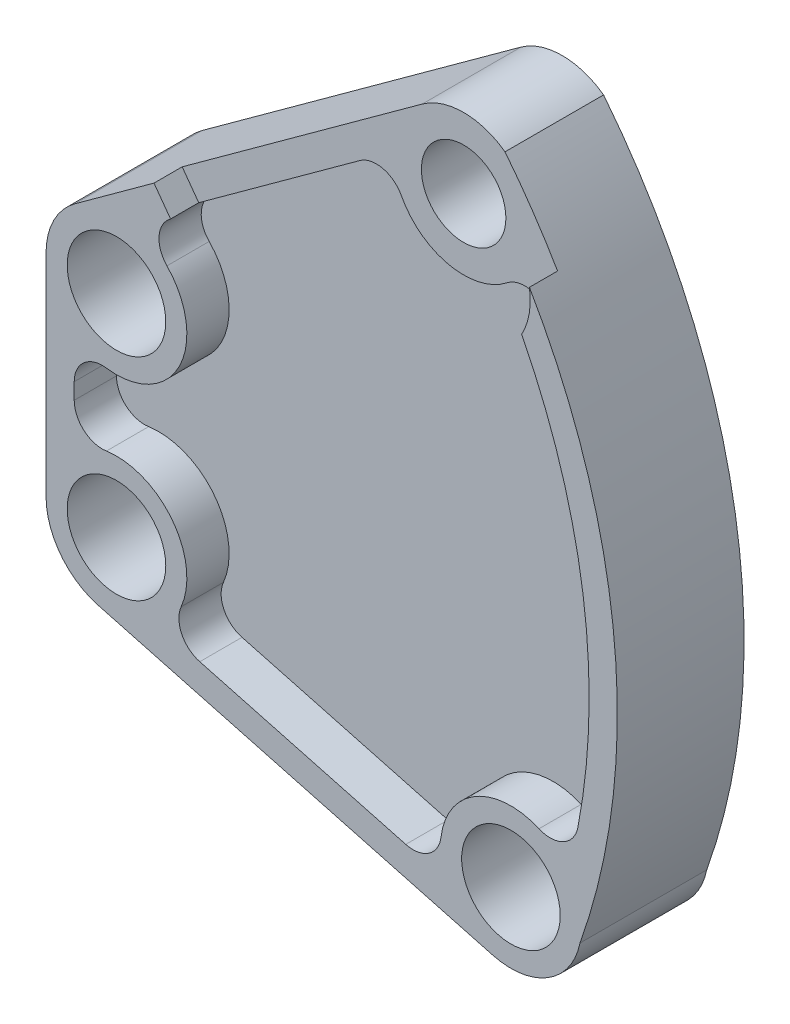
ISO-10303-21;
HEADER;
FILE_DESCRIPTION(('STEP AP214'),'2;1');
FILE_NAME('part.step','',(''),(''),'','','');
FILE_SCHEMA(('AUTOMOTIVE_DESIGN { 1 0 10303 214 1 1 1 1 }'));
ENDSEC;
DATA;
#1=APPLICATION_CONTEXT('core data for automotive mechanical design processes');
#2=APPLICATION_PROTOCOL_DEFINITION('international standard','automotive_design',2000,#1);
#3=PRODUCT_CONTEXT('',#1,'mechanical');
#4=PRODUCT('Part','Part','',(#3));
#5=PRODUCT_RELATED_PRODUCT_CATEGORY('part','',(#4));
#6=PRODUCT_DEFINITION_FORMATION('','',#4);
#7=PRODUCT_DEFINITION_CONTEXT('part definition',#1,'design');
#8=PRODUCT_DEFINITION('design','',#6,#7);
#9=PRODUCT_DEFINITION_SHAPE('','',#8);
#10=(LENGTH_UNIT() NAMED_UNIT(*) SI_UNIT(.MILLI.,.METRE.));
#11=(NAMED_UNIT(*) PLANE_ANGLE_UNIT() SI_UNIT($,.RADIAN.));
#12=(NAMED_UNIT(*) SI_UNIT($,.STERADIAN.) SOLID_ANGLE_UNIT());
#13=UNCERTAINTY_MEASURE_WITH_UNIT(LENGTH_MEASURE(1.E-05),#10,'distance_accuracy_value','');
#14=(GEOMETRIC_REPRESENTATION_CONTEXT(3) GLOBAL_UNCERTAINTY_ASSIGNED_CONTEXT((#13)) GLOBAL_UNIT_ASSIGNED_CONTEXT((#10,
#11,#12)) REPRESENTATION_CONTEXT('',''));
#15=CARTESIAN_POINT('',(0.,0.,0.));
#16=DIRECTION('',(0.,0.,1.));
#17=DIRECTION('',(1.,0.,0.));
#18=AXIS2_PLACEMENT_3D('',#15,#16,#17);
#19=CARTESIAN_POINT('',(-22.6524758424985,-16.4579870641893,12.));
#20=DIRECTION('',(0.,0.,1.));
#21=DIRECTION('',(1.,0.,0.));
#22=AXIS2_PLACEMENT_3D('',#19,#20,#21);
#23=CYLINDRICAL_SURFACE('',#22,5.);
#24=CARTESIAN_POINT('',(-22.6524758424985,-16.4579870641893,14.));
#25=DIRECTION('',(0.,0.,1.));
#26=DIRECTION('',(1.,0.,0.));
#27=AXIS2_PLACEMENT_3D('',#24,#25,#26);
#28=CIRCLE('',#27,5.);
#29=CARTESIAN_POINT('',(-23.3667615567843,-21.4067036572432,14.));
#30=VERTEX_POINT('',#29);
#31=CARTESIAN_POINT('',(-19.068726627153,-12.9713351513207,14.));
#32=VERTEX_POINT('',#31);
#33=EDGE_CURVE('E406',#30,#32,#28,.T.);
#34=ORIENTED_EDGE('',*,*,#33,.F.);
#35=DIRECTION('',(0.,0.,1.));
#36=VECTOR('',#35,1.);
#37=CARTESIAN_POINT('',(-23.3667615567843,-21.4067036572432,12.));
#38=LINE('',#37,#36);
#39=CARTESIAN_POINT('',(-23.3667615567843,-21.4067036572432,11.));
#40=VERTEX_POINT('',#39);
#41=EDGE_CURVE('E292',#30,#40,#38,.F.);
#42=ORIENTED_EDGE('',*,*,#41,.T.);
#43=CARTESIAN_POINT('',(-22.6524758424985,-16.4579870641893,11.));
#44=DIRECTION('',(0.,0.,-1.));
#45=DIRECTION('',(-1.,0.,0.));
#46=AXIS2_PLACEMENT_3D('',#43,#44,#45);
#47=CIRCLE('',#46,5.);
#48=CARTESIAN_POINT('',(-19.068726627153,-12.9713351513207,11.));
#49=VERTEX_POINT('',#48);
#50=EDGE_CURVE('E454',#49,#40,#47,.T.);
#51=ORIENTED_EDGE('',*,*,#50,.F.);
#52=DIRECTION('',(0.,0.,1.));
#53=VECTOR('',#52,1.);
#54=CARTESIAN_POINT('',(-19.068726627153,-12.9713351513207,12.));
#55=LINE('',#54,#53);
#56=EDGE_CURVE('E289',#49,#32,#55,.T.);
#57=ORIENTED_EDGE('',*,*,#56,.T.);
#58=EDGE_LOOP('',(#34,#42,#51,#57));
#59=FACE_BOUND('',#58,.T.);
#60=ADVANCED_FACE('F39',(#59),#23,.T.);
#61=CARTESIAN_POINT('',(-25.6524758424985,-27.4579870641893,12.));
#62=DIRECTION('',(1.,0.,0.));
#63=DIRECTION('',(0.,0.,-1.));
#64=AXIS2_PLACEMENT_3D('',#61,#62,#63);
#65=PLANE('',#64);
#66=DIRECTION('',(0.,-1.,0.));
#67=VECTOR('',#66,1.);
#68=CARTESIAN_POINT('',(-25.6524758424985,-20.4579870641892,11.));
#69=LINE('',#68,#67);
#70=CARTESIAN_POINT('',(-25.6524758424985,-23.3861902944648,11.));
#71=VERTEX_POINT('',#70);
#72=CARTESIAN_POINT('',(-25.6524758424985,-24.5297838339137,11.));
#73=VERTEX_POINT('',#72);
#74=EDGE_CURVE('E451',#71,#73,#69,.T.);
#75=ORIENTED_EDGE('',*,*,#74,.F.);
#76=DIRECTION('',(0.,0.,-1.));
#77=VECTOR('',#76,1.);
#78=CARTESIAN_POINT('',(-25.6524758424985,-23.3861902944648,14.));
#79=LINE('',#78,#77);
#80=CARTESIAN_POINT('',(-25.6524758424985,-23.3861902944648,14.));
#81=VERTEX_POINT('',#80);
#82=EDGE_CURVE('E286',#71,#81,#79,.F.);
#83=ORIENTED_EDGE('',*,*,#82,.T.);
#84=DIRECTION('',(0.,1.,0.));
#85=VECTOR('',#84,1.);
#86=CARTESIAN_POINT('',(-25.6524758424985,-27.4579870641893,14.));
#87=LINE('',#86,#85);
#88=CARTESIAN_POINT('',(-25.6524758424985,-24.5297838339137,14.));
#89=VERTEX_POINT('',#88);
#90=EDGE_CURVE('E382',#89,#81,#87,.T.);
#91=ORIENTED_EDGE('',*,*,#90,.F.);
#92=DIRECTION('',(0.,0.,-1.));
#93=VECTOR('',#92,1.);
#94=CARTESIAN_POINT('',(-25.6524758424985,-24.5297838339137,11.));
#95=LINE('',#94,#93);
#96=EDGE_CURVE('E284',#89,#73,#95,.T.);
#97=ORIENTED_EDGE('',*,*,#96,.T.);
#98=EDGE_LOOP('',(#75,#83,#91,#97));
#99=FACE_BOUND('',#98,.T.);
#100=ADVANCED_FACE('F513',(#99),#65,.T.);
#101=CARTESIAN_POINT('',(-22.6524758424985,-31.4579870641893,12.));
#102=DIRECTION('',(0.,0.,1.));
#103=DIRECTION('',(1.,0.,0.));
#104=AXIS2_PLACEMENT_3D('',#101,#102,#103);
#105=CYLINDRICAL_SURFACE('',#104,5.);
#106=CARTESIAN_POINT('',(-22.6524758424985,-31.4579870641893,14.));
#107=DIRECTION('',(0.,0.,1.));
#108=DIRECTION('',(1.,0.,0.));
#109=AXIS2_PLACEMENT_3D('',#106,#107,#108);
#110=CIRCLE('',#109,5.);
#111=CARTESIAN_POINT('',(-18.0572534247843,-33.4287561860644,14.));
#112=VERTEX_POINT('',#111);
#113=CARTESIAN_POINT('',(-23.3667615567843,-26.5092704711353,14.));
#114=VERTEX_POINT('',#113);
#115=EDGE_CURVE('E379',#112,#114,#110,.T.);
#116=ORIENTED_EDGE('',*,*,#115,.F.);
#117=DIRECTION('',(0.,0.,1.));
#118=VECTOR('',#117,1.);
#119=CARTESIAN_POINT('',(-18.0572534247843,-33.4287561860644,12.));
#120=LINE('',#119,#118);
#121=CARTESIAN_POINT('',(-18.0572534247843,-33.4287561860644,11.));
#122=VERTEX_POINT('',#121);
#123=EDGE_CURVE('E311',#112,#122,#120,.F.);
#124=ORIENTED_EDGE('',*,*,#123,.T.);
#125=CARTESIAN_POINT('',(-22.6524758424985,-31.4579870641893,11.));
#126=DIRECTION('',(0.,0.,-1.));
#127=DIRECTION('',(-1.,0.,0.));
#128=AXIS2_PLACEMENT_3D('',#125,#126,#127);
#129=CIRCLE('',#128,5.);
#130=CARTESIAN_POINT('',(-23.3667615567843,-26.5092704711353,11.));
#131=VERTEX_POINT('',#130);
#132=EDGE_CURVE('E448',#131,#122,#129,.T.);
#133=ORIENTED_EDGE('',*,*,#132,.F.);
#134=DIRECTION('',(0.,0.,1.));
#135=VECTOR('',#134,1.);
#136=CARTESIAN_POINT('',(-23.3667615567843,-26.5092704711353,12.));
#137=LINE('',#136,#135);
#138=EDGE_CURVE('E308',#131,#114,#137,.T.);
#139=ORIENTED_EDGE('',*,*,#138,.T.);
#140=EDGE_LOOP('',(#116,#124,#133,#139));
#141=FACE_BOUND('',#140,.T.);
#142=ADVANCED_FACE('F520',(#141),#105,.T.);
#143=CARTESIAN_POINT('',(0.719212679420618,-40.8262406706195,12.));
#144=DIRECTION('',(0.25881904510252,0.965925826289069,0.));
#145=DIRECTION('',(-0.965925826289069,0.25881904510252,0.));
#146=AXIS2_PLACEMENT_3D('',#143,#144,#145);
#147=PLANE('',#146);
#148=DIRECTION('',(0.965925826289068,-0.25881904510252,0.));
#149=VECTOR('',#148,1.);
#150=CARTESIAN_POINT('',(-19.5652296726498,-35.3910407234665,11.));
#151=LINE('',#150,#149);
#152=CARTESIAN_POINT('',(-16.7368025479036,-36.1489154873926,11.));
#153=VERTEX_POINT('',#152);
#154=CARTESIAN_POINT('',(-2.10921444532555,-40.0683659066934,11.));
#155=VERTEX_POINT('',#154);
#156=EDGE_CURVE('E445',#153,#155,#151,.T.);
#157=ORIENTED_EDGE('',*,*,#156,.F.);
#158=DIRECTION('',(0.,0.,-1.));
#159=VECTOR('',#158,1.);
#160=CARTESIAN_POINT('',(-16.7368025479036,-36.1489154873926,14.));
#161=LINE('',#160,#159);
#162=CARTESIAN_POINT('',(-16.7368025479036,-36.1489154873926,14.));
#163=VERTEX_POINT('',#162);
#164=EDGE_CURVE('E305',#153,#163,#161,.F.);
#165=ORIENTED_EDGE('',*,*,#164,.T.);
#166=DIRECTION('',(-0.965925826289069,0.25881904510252,0.));
#167=VECTOR('',#166,1.);
#168=CARTESIAN_POINT('',(0.719212679420618,-40.8262406706195,14.));
#169=LINE('',#168,#167);
#170=CARTESIAN_POINT('',(-2.10921444532555,-40.0683659066934,14.));
#171=VERTEX_POINT('',#170);
#172=EDGE_CURVE('E376',#171,#163,#169,.T.);
#173=ORIENTED_EDGE('',*,*,#172,.F.);
#174=DIRECTION('',(0.,0.,-1.));
#175=VECTOR('',#174,1.);
#176=CARTESIAN_POINT('',(-2.10921444532555,-40.0683659066934,11.));
#177=LINE('',#176,#175);
#178=EDGE_CURVE('E303',#171,#155,#177,.T.);
#179=ORIENTED_EDGE('',*,*,#178,.T.);
#180=EDGE_LOOP('',(#157,#165,#173,#179));
#181=FACE_BOUND('',#180,.T.);
#182=ADVANCED_FACE('F591',(#181),#147,.T.);
#183=CARTESIAN_POINT('',(5.35937311988448,-38.9637393721623,12.));
#184=DIRECTION('',(0.,0.,1.));
#185=DIRECTION('',(1.,0.,0.));
#186=AXIS2_PLACEMENT_3D('',#183,#184,#185);
#187=CYLINDRICAL_SURFACE('',#186,5.);
#188=CARTESIAN_POINT('',(5.35937311988448,-38.9637393721623,14.));
#189=DIRECTION('',(0.,0.,1.));
#190=DIRECTION('',(1.,0.,0.));
#191=AXIS2_PLACEMENT_3D('',#188,#189,#190);
#192=CIRCLE('',#191,5.);
#193=CARTESIAN_POINT('',(7.35080992285409,-34.3774359086115,14.));
#194=VERTEX_POINT('',#193);
#195=CARTESIAN_POINT('',(0.394409209166631,-38.372864287843,14.));
#196=VERTEX_POINT('',#195);
#197=EDGE_CURVE('E373',#194,#196,#192,.T.);
#198=ORIENTED_EDGE('',*,*,#197,.F.);
#199=DIRECTION('',(0.,0.,1.));
#200=VECTOR('',#199,1.);
#201=CARTESIAN_POINT('',(7.35080992285409,-34.3774359086115,12.));
#202=LINE('',#201,#200);
#203=CARTESIAN_POINT('',(7.35080992285408,-34.3774359086116,11.));
#204=VERTEX_POINT('',#203);
#205=EDGE_CURVE('E267',#194,#204,#202,.F.);
#206=ORIENTED_EDGE('',*,*,#205,.T.);
#207=CARTESIAN_POINT('',(5.35937311988446,-38.9637393721623,11.));
#208=DIRECTION('',(0.,0.,-1.));
#209=DIRECTION('',(-1.,0.,0.));
#210=AXIS2_PLACEMENT_3D('',#207,#208,#209);
#211=CIRCLE('',#210,4.99999999999999);
#212=CARTESIAN_POINT('',(0.394409209166627,-38.372864287843,11.));
#213=VERTEX_POINT('',#212);
#214=EDGE_CURVE('E442',#213,#204,#211,.T.);
#215=ORIENTED_EDGE('',*,*,#214,.F.);
#216=DIRECTION('',(0.,0.,1.));
#217=VECTOR('',#216,1.);
#218=CARTESIAN_POINT('',(0.39440920916663,-38.372864287843,12.));
#219=LINE('',#218,#217);
#220=EDGE_CURVE('E260',#213,#196,#219,.T.);
#221=ORIENTED_EDGE('',*,*,#220,.T.);
#222=EDGE_LOOP('',(#198,#206,#215,#221));
#223=FACE_BOUND('',#222,.T.);
#224=ADVANCED_FACE('F581',(#223),#187,.T.);
#225=CARTESIAN_POINT('',(-33.0866645912219,-24.5583554455818,12.));
#226=DIRECTION('',(0.,0.,1.));
#227=DIRECTION('',(1.,0.,0.));
#228=AXIS2_PLACEMENT_3D('',#225,#226,#227);
#229=CYLINDRICAL_SURFACE('',#228,44.);
#230=CARTESIAN_POINT('',(-33.086664591222,-24.5583554455818,11.));
#231=DIRECTION('',(0.,0.,1.));
#232=DIRECTION('',(1.,0.,0.));
#233=AXIS2_PLACEMENT_3D('',#230,#231,#232);
#234=CIRCLE('',#233,44.);
#235=CARTESIAN_POINT('',(10.1109107981021,-32.923131622125,11.));
#236=VERTEX_POINT('',#235);
#237=CARTESIAN_POINT('',(6.11949722855622,-4.58645329878155,11.));
#238=VERTEX_POINT('',#237);
#239=EDGE_CURVE('E426',#236,#238,#234,.T.);
#240=ORIENTED_EDGE('',*,*,#239,.F.);
#241=DIRECTION('',(0.,0.,1.));
#242=VECTOR('',#241,1.);
#243=CARTESIAN_POINT('',(10.1109107981021,-32.923131622125,12.));
#244=LINE('',#243,#242);
#245=CARTESIAN_POINT('',(10.1109107981021,-32.923131622125,14.));
#246=VERTEX_POINT('',#245);
#247=EDGE_CURVE('E258',#236,#246,#244,.T.);
#248=ORIENTED_EDGE('',*,*,#247,.T.);
#249=CARTESIAN_POINT('',(-33.0866645912219,-24.5583554455818,14.));
#250=DIRECTION('',(0.,0.,-1.));
#251=DIRECTION('',(-1.,0.,0.));
#252=AXIS2_PLACEMENT_3D('',#249,#250,#251);
#253=CIRCLE('',#252,44.);
#254=CARTESIAN_POINT('',(6.11949722855622,-4.58645329878154,14.));
#255=VERTEX_POINT('',#254);
#256=EDGE_CURVE('E244',#255,#246,#253,.T.);
#257=ORIENTED_EDGE('',*,*,#256,.F.);
#258=DIRECTION('',(0.,0.,1.));
#259=VECTOR('',#258,1.);
#260=CARTESIAN_POINT('',(6.11949722855622,-4.58645329878154,12.));
#261=LINE('',#260,#259);
#262=CARTESIAN_POINT('',(6.11949722855622,-4.58645329878156,12.));
#263=VERTEX_POINT('',#262);
#264=EDGE_CURVE('E237',#263,#255,#261,.T.);
#265=ORIENTED_EDGE('',*,*,#264,.F.);
#266=DIRECTION('',(0.,0.,1.));
#267=VECTOR('',#266,1.);
#268=CARTESIAN_POINT('',(6.11949722855622,-4.58645329878154,12.));
#269=LINE('',#268,#267);
#270=EDGE_CURVE('E240',#263,#238,#269,.F.);
#271=ORIENTED_EDGE('',*,*,#270,.T.);
#272=EDGE_LOOP('',(#240,#248,#257,#265,#271));
#273=FACE_BOUND('',#272,.T.);
#274=ADVANCED_FACE('F239',(#273),#229,.F.);
#275=CARTESIAN_POINT('',(1.73025928211613,-2.1917528478837,12.));
#276=DIRECTION('',(0.,0.,1.));
#277=DIRECTION('',(1.,0.,0.));
#278=AXIS2_PLACEMENT_3D('',#275,#276,#277);
#279=CYLINDRICAL_SURFACE('',#278,5.00000000000001);
#280=CARTESIAN_POINT('',(1.73025928211613,-2.1917528478837,14.));
#281=DIRECTION('',(0.,0.,-1.));
#282=DIRECTION('',(-1.,0.,0.));
#283=AXIS2_PLACEMENT_3D('',#280,#281,#282);
#284=CIRCLE('',#283,5.00000000000001);
#285=CARTESIAN_POINT('',(6.67035341824604,-1.42008586908067,14.));
#286=VERTEX_POINT('',#285);
#287=EDGE_CURVE('E370',#286,#255,#284,.T.);
#288=ORIENTED_EDGE('',*,*,#287,.F.);
#289=DIRECTION('',(0.,0.,1.));
#290=VECTOR('',#289,1.);
#291=CARTESIAN_POINT('',(6.67035341824604,-1.42008586908067,12.));
#292=LINE('',#291,#290);
#293=CARTESIAN_POINT('',(6.67035341824611,-1.42008586908083,12.));
#294=VERTEX_POINT('',#293);
#295=EDGE_CURVE('E248',#294,#286,#292,.T.);
#296=ORIENTED_EDGE('',*,*,#295,.F.);
#297=CARTESIAN_POINT('',(1.73025928211613,-2.1917528478837,12.));
#298=DIRECTION('',(0.,0.,-1.));
#299=DIRECTION('',(-1.,0.,0.));
#300=AXIS2_PLACEMENT_3D('',#297,#298,#299);
#301=CIRCLE('',#300,5.00000000000001);
#302=EDGE_CURVE('E224',#294,#263,#301,.T.);
#303=ORIENTED_EDGE('',*,*,#302,.T.);
#304=ORIENTED_EDGE('',*,*,#264,.T.);
#305=EDGE_LOOP('',(#288,#296,#303,#304));
#306=FACE_BOUND('',#305,.T.);
#307=ADVANCED_FACE('F251',(#306),#279,.F.);
#308=CARTESIAN_POINT('',(-33.0866645912219,-24.5583554455818,12.));
#309=DIRECTION('',(0.,0.,1.));
#310=DIRECTION('',(1.,0.,0.));
#311=AXIS2_PLACEMENT_3D('',#308,#309,#310);
#312=CYLINDRICAL_SURFACE('',#311,46.);
#313=CARTESIAN_POINT('',(-33.0866645912219,-24.5583554455818,14.));
#314=DIRECTION('',(0.,0.,1.));
#315=DIRECTION('',(1.,0.,0.));
#316=AXIS2_PLACEMENT_3D('',#313,#314,#315);
#317=CIRCLE('',#316,46.);
#318=CARTESIAN_POINT('',(10.2601455915492,-39.9549150281253,14.));
#319=VERTEX_POINT('',#318);
#320=EDGE_CURVE('E362',#319,#286,#317,.T.);
#321=ORIENTED_EDGE('',*,*,#320,.F.);
#322=DIRECTION('',(0.,0.,1.));
#323=VECTOR('',#322,1.);
#324=CARTESIAN_POINT('',(10.2601455915492,-39.9549150281253,12.));
#325=LINE('',#324,#323);
#326=CARTESIAN_POINT('',(10.2601455915492,-39.9549150281252,5.));
#327=VERTEX_POINT('',#326);
#328=EDGE_CURVE('E386',#327,#319,#325,.T.);
#329=ORIENTED_EDGE('',*,*,#328,.F.);
#330=CARTESIAN_POINT('',(-33.0866645912219,-24.5583554455818,5.));
#331=DIRECTION('',(0.,0.,-1.));
#332=DIRECTION('',(1.,0.,0.));
#333=AXIS2_PLACEMENT_3D('',#330,#331,#332);
#334=CIRCLE('',#333,46.);
#335=CARTESIAN_POINT('',(2.93892626146236,4.04508497187474,5.));
#336=VERTEX_POINT('',#335);
#337=EDGE_CURVE('E431',#336,#327,#334,.T.);
#338=ORIENTED_EDGE('',*,*,#337,.F.);
#339=DIRECTION('',(0.,0.,1.));
#340=VECTOR('',#339,1.);
#341=CARTESIAN_POINT('',(2.93892626146236,4.04508497187474,5.));
#342=LINE('',#341,#340);
#343=CARTESIAN_POINT('',(2.93892626146236,4.04508497187474,12.));
#344=VERTEX_POINT('',#343);
#345=EDGE_CURVE('E409',#336,#344,#342,.T.);
#346=ORIENTED_EDGE('',*,*,#345,.T.);
#347=CARTESIAN_POINT('',(-33.0866645912219,-24.5583554455818,12.));
#348=DIRECTION('',(0.,0.,-1.));
#349=DIRECTION('',(1.,0.,0.));
#350=AXIS2_PLACEMENT_3D('',#347,#348,#349);
#351=CIRCLE('',#350,46.);
#352=EDGE_CURVE('E421',#344,#294,#351,.T.);
#353=ORIENTED_EDGE('',*,*,#352,.T.);
#354=ORIENTED_EDGE('',*,*,#295,.T.);
#355=EDGE_LOOP('',(#321,#329,#338,#346,#353,#354));
#356=FACE_BOUND('',#355,.T.);
#357=ADVANCED_FACE('F574',(#356),#312,.T.);
#358=CARTESIAN_POINT('',(5.35937311988448,-38.9637393721623,12.));
#359=DIRECTION('',(0.,0.,1.));
#360=DIRECTION('',(1.,0.,0.));
#361=AXIS2_PLACEMENT_3D('',#358,#359,#360);
#362=CYLINDRICAL_SURFACE('',#361,5.);
#363=CARTESIAN_POINT('',(5.35937311988448,-38.9637393721623,14.));
#364=DIRECTION('',(0.,0.,1.));
#365=DIRECTION('',(1.,0.,0.));
#366=AXIS2_PLACEMENT_3D('',#363,#364,#365);
#367=CIRCLE('',#366,5.);
#368=CARTESIAN_POINT('',(4.06527789437187,-43.7933685036077,14.));
#369=VERTEX_POINT('',#368);
#370=EDGE_CURVE('E360',#369,#319,#367,.T.);
#371=ORIENTED_EDGE('',*,*,#370,.F.);
#372=DIRECTION('',(0.,0.,1.));
#373=VECTOR('',#372,1.);
#374=CARTESIAN_POINT('',(4.06527789437187,-43.7933685036077,12.));
#375=LINE('',#374,#373);
#376=CARTESIAN_POINT('',(4.06527789437188,-43.7933685036077,5.));
#377=VERTEX_POINT('',#376);
#378=EDGE_CURVE('E358',#377,#369,#375,.T.);
#379=ORIENTED_EDGE('',*,*,#378,.F.);
#380=CARTESIAN_POINT('',(5.35937311988448,-38.9637393721623,5.));
#381=DIRECTION('',(0.,0.,-1.));
#382=DIRECTION('',(1.,0.,0.));
#383=AXIS2_PLACEMENT_3D('',#380,#381,#382);
#384=CIRCLE('',#383,5.00000000000001);
#385=EDGE_CURVE('E429',#327,#377,#384,.T.);
#386=ORIENTED_EDGE('',*,*,#385,.F.);
#387=ORIENTED_EDGE('',*,*,#328,.T.);
#388=EDGE_LOOP('',(#371,#379,#386,#387));
#389=FACE_BOUND('',#388,.T.);
#390=ADVANCED_FACE('F576',(#389),#362,.T.);
#391=CARTESIAN_POINT('',(-27.6524758424985,-35.2946220040841,12.));
#392=DIRECTION('',(-0.258819045102521,-0.965925826289068,0.));
#393=DIRECTION('',(0.965925826289068,-0.258819045102521,0.));
#394=AXIS2_PLACEMENT_3D('',#391,#392,#393);
#395=PLANE('',#394);
#396=DIRECTION('',(0.965925826289068,-0.258819045102521,0.));
#397=VECTOR('',#396,1.);
#398=CARTESIAN_POINT('',(-27.6524758424985,-35.2946220040841,14.));
#399=LINE('',#398,#397);
#400=CARTESIAN_POINT('',(-23.9465710680111,-36.2876161956346,14.));
#401=VERTEX_POINT('',#400);
#402=EDGE_CURVE('E354',#401,#369,#399,.T.);
#403=ORIENTED_EDGE('',*,*,#402,.F.);
#404=DIRECTION('',(0.,0.,1.));
#405=VECTOR('',#404,1.);
#406=CARTESIAN_POINT('',(-23.9465710680111,-36.2876161956346,12.));
#407=LINE('',#406,#405);
#408=CARTESIAN_POINT('',(-23.9465710680111,-36.2876161956346,5.));
#409=VERTEX_POINT('',#408);
#410=EDGE_CURVE('E62',#401,#409,#407,.F.);
#411=ORIENTED_EDGE('',*,*,#410,.T.);
#412=DIRECTION('',(-0.965925826289069,0.25881904510252,0.));
#413=VECTOR('',#412,1.);
#414=CARTESIAN_POINT('',(-27.6524758424986,-35.2946220040841,5.));
#415=LINE('',#414,#413);
#416=EDGE_CURVE('E340',#377,#409,#415,.T.);
#417=ORIENTED_EDGE('',*,*,#416,.F.);
#418=ORIENTED_EDGE('',*,*,#378,.T.);
#419=EDGE_LOOP('',(#403,#411,#417,#418));
#420=FACE_BOUND('',#419,.T.);
#421=ADVANCED_FACE('F357',(#420),#395,.T.);
#422=CARTESIAN_POINT('',(-27.6524758424985,-13.9103598167171,12.));
#423=DIRECTION('',(-1.,0.,0.));
#424=DIRECTION('',(0.,-1.,0.));
#425=AXIS2_PLACEMENT_3D('',#422,#423,#424);
#426=PLANE('',#425);
#427=DIRECTION('',(0.,1.,0.));
#428=VECTOR('',#427,1.);
#429=CARTESIAN_POINT('',(-27.6524758424985,-13.9103598167171,5.));
#430=LINE('',#429,#428);
#431=CARTESIAN_POINT('',(-27.6524758424986,-31.4579870641893,5.));
#432=VERTEX_POINT('',#431);
#433=CARTESIAN_POINT('',(-27.6524758424985,-16.4579870641893,5.));
#434=VERTEX_POINT('',#433);
#435=EDGE_CURVE('E338',#432,#434,#430,.T.);
#436=ORIENTED_EDGE('',*,*,#435,.F.);
#437=DIRECTION('',(0.,0.,1.));
#438=VECTOR('',#437,1.);
#439=CARTESIAN_POINT('',(-27.6524758424985,-31.4579870641893,12.));
#440=LINE('',#439,#438);
#441=CARTESIAN_POINT('',(-27.6524758424985,-31.4579870641892,14.));
#442=VERTEX_POINT('',#441);
#443=EDGE_CURVE('E327',#432,#442,#440,.T.);
#444=ORIENTED_EDGE('',*,*,#443,.T.);
#445=DIRECTION('',(0.,-1.,0.));
#446=VECTOR('',#445,1.);
#447=CARTESIAN_POINT('',(-27.6524758424985,-13.9103598167171,14.));
#448=LINE('',#447,#446);
#449=CARTESIAN_POINT('',(-27.6524758424985,-16.4579870641893,14.));
#450=VERTEX_POINT('',#449);
#451=EDGE_CURVE('E356',#450,#442,#448,.T.);
#452=ORIENTED_EDGE('',*,*,#451,.F.);
#453=DIRECTION('',(0.,0.,1.));
#454=VECTOR('',#453,1.);
#455=CARTESIAN_POINT('',(-27.6524758424985,-16.4579870641893,12.));
#456=LINE('',#455,#454);
#457=EDGE_CURVE('E325',#450,#434,#456,.F.);
#458=ORIENTED_EDGE('',*,*,#457,.T.);
#459=EDGE_LOOP('',(#436,#444,#452,#458));
#460=FACE_BOUND('',#459,.T.);
#461=ADVANCED_FACE('F344',(#460),#426,.T.);
#462=CARTESIAN_POINT('',(-19.9863679501846,-8.34060640867353,12.));
#463=DIRECTION('',(-0.58778525229247,0.809016994374949,0.));
#464=DIRECTION('',(-0.809016994374949,-0.58778525229247,0.));
#465=AXIS2_PLACEMENT_3D('',#462,#463,#464);
#466=PLANE('',#465);
#467=DIRECTION('',(0.809016994374947,0.587785252292474,0.));
#468=VECTOR('',#467,1.);
#469=CARTESIAN_POINT('',(-2.93892626146235,4.04508497187475,5.));
#470=LINE('',#469,#468);
#471=CARTESIAN_POINT('',(-25.5914021039609,-12.4129020923145,5.));
#472=VERTEX_POINT('',#471);
#473=CARTESIAN_POINT('',(-2.93892626146235,4.04508497187475,5.));
#474=VERTEX_POINT('',#473);
#475=EDGE_CURVE('E348',#472,#474,#470,.T.);
#476=ORIENTED_EDGE('',*,*,#475,.F.);
#477=DIRECTION('',(0.,0.,1.));
#478=VECTOR('',#477,1.);
#479=CARTESIAN_POINT('',(-25.5914021039609,-12.4129020923145,12.));
#480=LINE('',#479,#478);
#481=CARTESIAN_POINT('',(-25.5914021039609,-12.4129020923145,14.));
#482=VERTEX_POINT('',#481);
#483=EDGE_CURVE('E11',#472,#482,#480,.T.);
#484=ORIENTED_EDGE('',*,*,#483,.T.);
#485=DIRECTION('',(-0.809016994374949,-0.58778525229247,0.));
#486=VECTOR('',#485,1.);
#487=CARTESIAN_POINT('',(-19.9863679501846,-8.34060640867353,14.));
#488=LINE('',#487,#486);
#489=CARTESIAN_POINT('',(-19.9863679501846,-8.34060640867353,14.));
#490=VERTEX_POINT('',#489);
#491=EDGE_CURVE('E364',#490,#482,#488,.T.);
#492=ORIENTED_EDGE('',*,*,#491,.F.);
#493=DIRECTION('',(0.,0.,1.));
#494=VECTOR('',#493,1.);
#495=CARTESIAN_POINT('',(-19.9863679501846,-8.34060640867353,12.));
#496=LINE('',#495,#494);
#497=CARTESIAN_POINT('',(-19.9863679501846,-8.3406064086735,12.));
#498=VERTEX_POINT('',#497);
#499=EDGE_CURVE('E388',#498,#490,#496,.T.);
#500=ORIENTED_EDGE('',*,*,#499,.F.);
#501=DIRECTION('',(0.809016994374947,0.587785252292474,0.));
#502=VECTOR('',#501,1.);
#503=CARTESIAN_POINT('',(-2.93892626146235,4.04508497187475,12.));
#504=LINE('',#503,#502);
#505=CARTESIAN_POINT('',(-2.93892626146235,4.04508497187475,12.));
#506=VERTEX_POINT('',#505);
#507=EDGE_CURVE('E418',#498,#506,#504,.T.);
#508=ORIENTED_EDGE('',*,*,#507,.T.);
#509=DIRECTION('',(0.,0.,1.));
#510=VECTOR('',#509,1.);
#511=CARTESIAN_POINT('',(-2.93892626146235,4.04508497187475,5.));
#512=LINE('',#511,#510);
#513=EDGE_CURVE('E415',#474,#506,#512,.T.);
#514=ORIENTED_EDGE('',*,*,#513,.F.);
#515=EDGE_LOOP('',(#476,#484,#492,#500,#508,#514));
#516=FACE_BOUND('',#515,.T.);
#517=ADVANCED_FACE('F564',(#516),#466,.T.);
#518=CARTESIAN_POINT('',(-18.8107974455997,-9.9586403974234,12.));
#519=DIRECTION('',(0.809016994374949,0.587785252292472,0.));
#520=DIRECTION('',(-0.587785252292472,0.809016994374949,0.));
#521=AXIS2_PLACEMENT_3D('',#518,#519,#520);
#522=PLANE('',#521);
#523=DIRECTION('',(-0.587785252292472,0.809016994374949,0.));
#524=VECTOR('',#523,1.);
#525=CARTESIAN_POINT('',(-18.8107974455997,-9.9586403974234,14.));
#526=LINE('',#525,#524);
#527=CARTESIAN_POINT('',(-18.8107974455997,-9.9586403974234,14.));
#528=VERTEX_POINT('',#527);
#529=EDGE_CURVE('E404',#528,#490,#526,.T.);
#530=ORIENTED_EDGE('',*,*,#529,.F.);
#531=DIRECTION('',(0.,0.,1.));
#532=VECTOR('',#531,1.);
#533=CARTESIAN_POINT('',(-18.8107974455997,-9.9586403974234,12.));
#534=LINE('',#533,#532);
#535=CARTESIAN_POINT('',(-18.8107974455997,-9.9586403974234,12.));
#536=VERTEX_POINT('',#535);
#537=EDGE_CURVE('E252',#536,#528,#534,.T.);
#538=ORIENTED_EDGE('',*,*,#537,.F.);
#539=DIRECTION('',(-0.587785252292472,0.809016994374949,0.));
#540=VECTOR('',#539,1.);
#541=CARTESIAN_POINT('',(-18.8107974455997,-9.9586403974234,12.));
#542=LINE('',#541,#540);
#543=EDGE_CURVE('E253',#536,#498,#542,.T.);
#544=ORIENTED_EDGE('',*,*,#543,.T.);
#545=ORIENTED_EDGE('',*,*,#499,.T.);
#546=EDGE_LOOP('',(#530,#538,#544,#545));
#547=FACE_BOUND('',#546,.T.);
#548=ADVANCED_FACE('F401',(#547),#522,.T.);
#549=CARTESIAN_POINT('',(-21.1797636218762,-11.6797950718945,12.));
#550=DIRECTION('',(0.587785252292471,-0.809016994374949,0.));
#551=DIRECTION('',(0.809016994374949,0.587785252292471,0.));
#552=AXIS2_PLACEMENT_3D('',#549,#550,#551);
#553=PLANE('',#552);
#554=DIRECTION('',(-0.809016994374947,-0.587785252292473,0.));
#555=VECTOR('',#554,1.);
#556=CARTESIAN_POINT('',(-4.99942373437721,0.0759099739549556,12.));
#557=LINE('',#556,#555);
#558=CARTESIAN_POINT('',(-7.36838991065372,-1.64524470051617,12.));
#559=VERTEX_POINT('',#558);
#560=EDGE_CURVE('E436',#559,#536,#557,.T.);
#561=ORIENTED_EDGE('',*,*,#560,.T.);
#562=DIRECTION('',(0.,0.,-1.));
#563=VECTOR('',#562,1.);
#564=CARTESIAN_POINT('',(-18.8107974455997,-9.9586403974234,11.));
#565=LINE('',#564,#563);
#566=CARTESIAN_POINT('',(-18.8107974455997,-9.9586403974234,11.));
#567=VERTEX_POINT('',#566);
#568=EDGE_CURVE('E297',#536,#567,#565,.T.);
#569=ORIENTED_EDGE('',*,*,#568,.T.);
#570=DIRECTION('',(-0.809016994374947,-0.587785252292473,0.));
#571=VECTOR('',#570,1.);
#572=CARTESIAN_POINT('',(-4.99942373437721,0.0759099739549556,11.));
#573=LINE('',#572,#571);
#574=CARTESIAN_POINT('',(-7.36838991065372,-1.64524470051617,11.));
#575=VERTEX_POINT('',#574);
#576=EDGE_CURVE('E457',#575,#567,#573,.T.);
#577=ORIENTED_EDGE('',*,*,#576,.F.);
#578=DIRECTION('',(0.,0.,1.));
#579=VECTOR('',#578,1.);
#580=CARTESIAN_POINT('',(-7.36838991065368,-1.64524470051622,12.));
#581=LINE('',#580,#579);
#582=EDGE_CURVE('E294',#575,#559,#581,.T.);
#583=ORIENTED_EDGE('',*,*,#582,.T.);
#584=EDGE_LOOP('',(#561,#569,#577,#583));
#585=FACE_BOUND('',#584,.T.);
#586=ADVANCED_FACE('F490',(#585),#553,.T.);
#587=CARTESIAN_POINT('',(-22.6524758424985,-16.4579870641893,14.));
#588=DIRECTION('',(0.,0.,1.));
#589=DIRECTION('',(1.,0.,0.));
#590=AXIS2_PLACEMENT_3D('',#587,#588,#589);
#591=PLANE('',#590);
#592=CARTESIAN_POINT('',(-22.6524758424985,-31.4579870641893,14.));
#593=DIRECTION('',(0.,0.,1.));
#594=DIRECTION('',(1.,0.,0.));
#595=AXIS2_PLACEMENT_3D('',#592,#593,#594);
#596=CIRCLE('',#595,3.49999999999999);
#597=CARTESIAN_POINT('',(-19.1524758424986,-31.4579870641893,14.));
#598=VERTEX_POINT('',#597);
#599=EDGE_CURVE('E482',#598,#598,#596,.T.);
#600=ORIENTED_EDGE('',*,*,#599,.F.);
#601=EDGE_LOOP('',(#600));
#602=FACE_BOUND('',#601,.T.);
#603=CARTESIAN_POINT('',(-22.6524758424985,-16.4579870641893,14.));
#604=DIRECTION('',(0.,0.,1.));
#605=DIRECTION('',(1.,0.,0.));
#606=AXIS2_PLACEMENT_3D('',#603,#604,#605);
#607=CIRCLE('',#606,3.49999999999999);
#608=CARTESIAN_POINT('',(-19.1524758424986,-16.4579870641893,14.));
#609=VERTEX_POINT('',#608);
#610=EDGE_CURVE('E476',#609,#609,#607,.T.);
#611=ORIENTED_EDGE('',*,*,#610,.F.);
#612=EDGE_LOOP('',(#611));
#613=FACE_BOUND('',#612,.T.);
#614=CARTESIAN_POINT('',(5.35937311988447,-38.9637393721623,14.));
#615=DIRECTION('',(0.,0.,1.));
#616=DIRECTION('',(1.,0.,0.));
#617=AXIS2_PLACEMENT_3D('',#614,#615,#616);
#618=CIRCLE('',#617,3.49999999999999);
#619=CARTESIAN_POINT('',(8.85937311988446,-38.9637393721623,14.));
#620=VERTEX_POINT('',#619);
#621=EDGE_CURVE('E470',#620,#620,#618,.T.);
#622=ORIENTED_EDGE('',*,*,#621,.F.);
#623=EDGE_LOOP('',(#622));
#624=FACE_BOUND('',#623,.T.);
#625=ORIENTED_EDGE('',*,*,#451,.T.);
#626=CARTESIAN_POINT('',(-22.6524758424985,-31.4579870641893,14.));
#627=DIRECTION('',(0.,0.,1.));
#628=DIRECTION('',(1.,0.,0.));
#629=AXIS2_PLACEMENT_3D('',#626,#627,#628);
#630=CIRCLE('',#629,5.);
#631=EDGE_CURVE('E332',#442,#401,#630,.T.);
#632=ORIENTED_EDGE('',*,*,#631,.T.);
#633=ORIENTED_EDGE('',*,*,#402,.T.);
#634=ORIENTED_EDGE('',*,*,#370,.T.);
#635=ORIENTED_EDGE('',*,*,#320,.T.);
#636=ORIENTED_EDGE('',*,*,#287,.T.);
#637=ORIENTED_EDGE('',*,*,#256,.T.);
#638=CARTESIAN_POINT('',(8.14738464404191,-32.5429145231912,14.));
#639=DIRECTION('',(0.,0.,1.));
#640=DIRECTION('',(1.,0.,0.));
#641=AXIS2_PLACEMENT_3D('',#638,#639,#640);
#642=CIRCLE('',#641,2.);
#643=EDGE_CURVE('E313',#246,#194,#642,.F.);
#644=ORIENTED_EDGE('',*,*,#643,.T.);
#645=ORIENTED_EDGE('',*,*,#197,.T.);
#646=CARTESIAN_POINT('',(-1.59157635512051,-38.1365142541153,14.));
#647=DIRECTION('',(0.,0.,1.));
#648=DIRECTION('',(1.,0.,0.));
#649=AXIS2_PLACEMENT_3D('',#646,#647,#648);
#650=CIRCLE('',#649,2.);
#651=EDGE_CURVE('E323',#196,#171,#650,.F.);
#652=ORIENTED_EDGE('',*,*,#651,.T.);
#653=ORIENTED_EDGE('',*,*,#172,.T.);
#654=CARTESIAN_POINT('',(-16.2191644576986,-34.2170638348144,14.));
#655=DIRECTION('',(0.,0.,1.));
#656=DIRECTION('',(1.,0.,0.));
#657=AXIS2_PLACEMENT_3D('',#654,#655,#656);
#658=CIRCLE('',#657,2.);
#659=EDGE_CURVE('E319',#163,#112,#658,.F.);
#660=ORIENTED_EDGE('',*,*,#659,.T.);
#661=ORIENTED_EDGE('',*,*,#115,.T.);
#662=CARTESIAN_POINT('',(-23.6524758424985,-24.5297838339137,14.));
#663=DIRECTION('',(0.,0.,1.));
#664=DIRECTION('',(1.,0.,0.));
#665=AXIS2_PLACEMENT_3D('',#662,#663,#664);
#666=CIRCLE('',#665,2.);
#667=EDGE_CURVE('E321',#114,#89,#666,.F.);
#668=ORIENTED_EDGE('',*,*,#667,.T.);
#669=ORIENTED_EDGE('',*,*,#90,.T.);
#670=CARTESIAN_POINT('',(-23.6524758424985,-23.3861902944648,14.));
#671=DIRECTION('',(0.,0.,1.));
#672=DIRECTION('',(1.,0.,0.));
#673=AXIS2_PLACEMENT_3D('',#670,#671,#672);
#674=CIRCLE('',#673,2.);
#675=EDGE_CURVE('E315',#81,#30,#674,.F.);
#676=ORIENTED_EDGE('',*,*,#675,.T.);
#677=ORIENTED_EDGE('',*,*,#33,.T.);
#678=CARTESIAN_POINT('',(-17.6352269410147,-11.5766743861733,14.));
#679=DIRECTION('',(0.,0.,1.));
#680=DIRECTION('',(1.,0.,0.));
#681=AXIS2_PLACEMENT_3D('',#678,#679,#680);
#682=CIRCLE('',#681,2.);
#683=EDGE_CURVE('E233',#32,#528,#682,.F.);
#684=ORIENTED_EDGE('',*,*,#683,.T.);
#685=ORIENTED_EDGE('',*,*,#529,.T.);
#686=ORIENTED_EDGE('',*,*,#491,.T.);
#687=CARTESIAN_POINT('',(-22.6524758424985,-16.4579870641893,14.));
#688=DIRECTION('',(0.,0.,1.));
#689=DIRECTION('',(1.,0.,0.));
#690=AXIS2_PLACEMENT_3D('',#687,#688,#689);
#691=CIRCLE('',#690,5.);
#692=EDGE_CURVE('E330',#482,#450,#691,.T.);
#693=ORIENTED_EDGE('',*,*,#692,.T.);
#694=EDGE_LOOP('',(#625,#632,#633,#634,#635,#636,#637,#644,#645,#652,#653,#660,#661,#668,#669,
#676,#677,#684,#685,#686,#693));
#695=FACE_BOUND('',#694,.T.);
#696=ADVANCED_FACE('F352',(#602,#613,#624,#695),#591,.T.);
#697=CARTESIAN_POINT('',(0.,0.,12.));
#698=DIRECTION('',(0.,0.,1.));
#699=DIRECTION('',(1.,0.,0.));
#700=AXIS2_PLACEMENT_3D('',#697,#698,#699);
#701=PLANE('',#700);
#702=CARTESIAN_POINT('',(0.,0.,12.));
#703=DIRECTION('',(0.,0.,1.));
#704=DIRECTION('',(1.,0.,0.));
#705=AXIS2_PLACEMENT_3D('',#702,#703,#704);
#706=CIRCLE('',#705,2.99999999999999);
#707=CARTESIAN_POINT('',(2.99999999999999,0.,12.));
#708=VERTEX_POINT('',#707);
#709=EDGE_CURVE('E464',#708,#708,#706,.T.);
#710=ORIENTED_EDGE('',*,*,#709,.F.);
#711=EDGE_LOOP('',(#710));
#712=FACE_BOUND('',#711,.T.);
#713=CARTESIAN_POINT('',(0.,0.,12.));
#714=DIRECTION('',(0.,0.,-1.));
#715=DIRECTION('',(-1.,0.,0.));
#716=AXIS2_PLACEMENT_3D('',#713,#714,#715);
#717=CIRCLE('',#716,5.);
#718=CARTESIAN_POINT('',(3.09814211715775,-3.92447645194786,12.));
#719=VERTEX_POINT('',#718);
#720=CARTESIAN_POINT('',(-4.42344243290624,-2.3309133494758,12.));
#721=VERTEX_POINT('',#720);
#722=EDGE_CURVE('E227',#719,#721,#717,.T.);
#723=ORIENTED_EDGE('',*,*,#722,.F.);
#724=CARTESIAN_POINT('',(4.33739896402085,-5.49426703272701,12.));
#725=DIRECTION('',(0.,0.,1.));
#726=DIRECTION('',(1.,0.,0.));
#727=AXIS2_PLACEMENT_3D('',#724,#725,#726);
#728=CIRCLE('',#727,2.);
#729=EDGE_CURVE('E220',#719,#263,#728,.F.);
#730=ORIENTED_EDGE('',*,*,#729,.T.);
#731=ORIENTED_EDGE('',*,*,#302,.F.);
#732=ORIENTED_EDGE('',*,*,#352,.F.);
#733=CARTESIAN_POINT('',(0.,0.,12.));
#734=DIRECTION('',(0.,0.,-1.));
#735=DIRECTION('',(1.,0.,0.));
#736=AXIS2_PLACEMENT_3D('',#733,#734,#735);
#737=CIRCLE('',#736,5.);
#738=EDGE_CURVE('E423',#506,#344,#737,.T.);
#739=ORIENTED_EDGE('',*,*,#738,.F.);
#740=ORIENTED_EDGE('',*,*,#507,.F.);
#741=ORIENTED_EDGE('',*,*,#543,.F.);
#742=ORIENTED_EDGE('',*,*,#560,.F.);
#743=CARTESIAN_POINT('',(-6.19281940606874,-3.26327868926612,12.));
#744=DIRECTION('',(0.,0.,1.));
#745=DIRECTION('',(1.,0.,0.));
#746=AXIS2_PLACEMENT_3D('',#743,#744,#745);
#747=CIRCLE('',#746,2.);
#748=EDGE_CURVE('E232',#559,#721,#747,.F.);
#749=ORIENTED_EDGE('',*,*,#748,.T.);
#750=EDGE_LOOP('',(#723,#730,#731,#732,#739,#740,#741,#742,#749));
#751=FACE_BOUND('',#750,.T.);
#752=ADVANCED_FACE('F222',(#712,#751),#701,.T.);
#753=CARTESIAN_POINT('',(0.,0.,5.));
#754=DIRECTION('',(0.,0.,1.));
#755=DIRECTION('',(1.,0.,0.));
#756=AXIS2_PLACEMENT_3D('',#753,#754,#755);
#757=CYLINDRICAL_SURFACE('',#756,5.);
#758=ORIENTED_EDGE('',*,*,#738,.T.);
#759=ORIENTED_EDGE('',*,*,#345,.F.);
#760=CARTESIAN_POINT('',(0.,0.,5.));
#761=DIRECTION('',(0.,0.,-1.));
#762=DIRECTION('',(1.,0.,0.));
#763=AXIS2_PLACEMENT_3D('',#760,#761,#762);
#764=CIRCLE('',#763,5.);
#765=EDGE_CURVE('E420',#474,#336,#764,.T.);
#766=ORIENTED_EDGE('',*,*,#765,.F.);
#767=ORIENTED_EDGE('',*,*,#513,.T.);
#768=EDGE_LOOP('',(#758,#759,#766,#767));
#769=FACE_BOUND('',#768,.T.);
#770=ADVANCED_FACE('F570',(#769),#757,.T.);
#771=CARTESIAN_POINT('',(0.,0.,5.));
#772=DIRECTION('',(0.,0.,1.));
#773=DIRECTION('',(1.,0.,0.));
#774=AXIS2_PLACEMENT_3D('',#771,#772,#773);
#775=PLANE('',#774);
#776=CARTESIAN_POINT('',(-22.6524758424985,-31.4579870641893,5.00000000000001));
#777=DIRECTION('',(0.,0.,1.));
#778=DIRECTION('',(1.,0.,0.));
#779=AXIS2_PLACEMENT_3D('',#776,#777,#778);
#780=CIRCLE('',#779,3.49999999999999);
#781=CARTESIAN_POINT('',(-19.1524758424986,-31.4579870641893,5.00000000000001));
#782=VERTEX_POINT('',#781);
#783=EDGE_CURVE('E479',#782,#782,#780,.T.);
#784=ORIENTED_EDGE('',*,*,#783,.T.);
#785=EDGE_LOOP('',(#784));
#786=FACE_BOUND('',#785,.T.);
#787=CARTESIAN_POINT('',(-22.6524758424985,-16.4579870641893,5.00000000000001));
#788=DIRECTION('',(0.,0.,1.));
#789=DIRECTION('',(1.,0.,0.));
#790=AXIS2_PLACEMENT_3D('',#787,#788,#789);
#791=CIRCLE('',#790,3.49999999999999);
#792=CARTESIAN_POINT('',(-19.1524758424986,-16.4579870641893,5.00000000000001));
#793=VERTEX_POINT('',#792);
#794=EDGE_CURVE('E473',#793,#793,#791,.T.);
#795=ORIENTED_EDGE('',*,*,#794,.T.);
#796=EDGE_LOOP('',(#795));
#797=FACE_BOUND('',#796,.T.);
#798=CARTESIAN_POINT('',(5.35937311988447,-38.9637393721623,5.00000000000001));
#799=DIRECTION('',(0.,0.,1.));
#800=DIRECTION('',(1.,0.,0.));
#801=AXIS2_PLACEMENT_3D('',#798,#799,#800);
#802=CIRCLE('',#801,3.49999999999999);
#803=CARTESIAN_POINT('',(8.85937311988446,-38.9637393721623,5.00000000000001));
#804=VERTEX_POINT('',#803);
#805=EDGE_CURVE('E467',#804,#804,#802,.T.);
#806=ORIENTED_EDGE('',*,*,#805,.T.);
#807=EDGE_LOOP('',(#806));
#808=FACE_BOUND('',#807,.T.);
#809=CARTESIAN_POINT('',(0.,0.,5.00000000000001));
#810=DIRECTION('',(0.,0.,1.));
#811=DIRECTION('',(1.,0.,0.));
#812=AXIS2_PLACEMENT_3D('',#809,#810,#811);
#813=CIRCLE('',#812,2.99999999999999);
#814=CARTESIAN_POINT('',(2.99999999999999,0.,5.00000000000001));
#815=VERTEX_POINT('',#814);
#816=EDGE_CURVE('E440',#815,#815,#813,.T.);
#817=ORIENTED_EDGE('',*,*,#816,.T.);
#818=EDGE_LOOP('',(#817));
#819=FACE_BOUND('',#818,.T.);
#820=ORIENTED_EDGE('',*,*,#416,.T.);
#821=CARTESIAN_POINT('',(-22.6524758424985,-31.4579870641893,5.));
#822=DIRECTION('',(0.,0.,1.));
#823=DIRECTION('',(1.,0.,0.));
#824=AXIS2_PLACEMENT_3D('',#821,#822,#823);
#825=CIRCLE('',#824,5.);
#826=EDGE_CURVE('E47',#409,#432,#825,.F.);
#827=ORIENTED_EDGE('',*,*,#826,.T.);
#828=ORIENTED_EDGE('',*,*,#435,.T.);
#829=CARTESIAN_POINT('',(-22.6524758424985,-16.4579870641893,5.));
#830=DIRECTION('',(0.,0.,1.));
#831=DIRECTION('',(1.,0.,0.));
#832=AXIS2_PLACEMENT_3D('',#829,#830,#831);
#833=CIRCLE('',#832,5.);
#834=EDGE_CURVE('E54',#434,#472,#833,.F.);
#835=ORIENTED_EDGE('',*,*,#834,.T.);
#836=ORIENTED_EDGE('',*,*,#475,.T.);
#837=ORIENTED_EDGE('',*,*,#765,.T.);
#838=ORIENTED_EDGE('',*,*,#337,.T.);
#839=ORIENTED_EDGE('',*,*,#385,.T.);
#840=EDGE_LOOP('',(#820,#827,#828,#835,#836,#837,#838,#839));
#841=FACE_BOUND('',#840,.T.);
#842=ADVANCED_FACE('F337',(#786,#797,#808,#819,#841),#775,.F.);
#843=CARTESIAN_POINT('',(0.,0.,11.));
#844=DIRECTION('',(0.,0.,1.));
#845=DIRECTION('',(1.,0.,0.));
#846=AXIS2_PLACEMENT_3D('',#843,#844,#845);
#847=CYLINDRICAL_SURFACE('',#846,5.);
#848=CARTESIAN_POINT('',(0.,0.,11.));
#849=DIRECTION('',(0.,0.,-1.));
#850=DIRECTION('',(-1.,0.,0.));
#851=AXIS2_PLACEMENT_3D('',#848,#849,#850);
#852=CIRCLE('',#851,5.);
#853=CARTESIAN_POINT('',(3.09814211715775,-3.92447645194786,11.));
#854=VERTEX_POINT('',#853);
#855=CARTESIAN_POINT('',(-4.42344243290624,-2.3309133494758,11.));
#856=VERTEX_POINT('',#855);
#857=EDGE_CURVE('E438',#854,#856,#852,.T.);
#858=ORIENTED_EDGE('',*,*,#857,.F.);
#859=DIRECTION('',(0.,0.,1.));
#860=VECTOR('',#859,1.);
#861=CARTESIAN_POINT('',(3.09814211715775,-3.92447645194786,11.));
#862=LINE('',#861,#860);
#863=EDGE_CURVE('E301',#854,#719,#862,.T.);
#864=ORIENTED_EDGE('',*,*,#863,.T.);
#865=ORIENTED_EDGE('',*,*,#722,.T.);
#866=DIRECTION('',(0.,0.,1.));
#867=VECTOR('',#866,1.);
#868=CARTESIAN_POINT('',(-4.42344243290624,-2.3309133494758,11.));
#869=LINE('',#868,#867);
#870=EDGE_CURVE('E299',#721,#856,#869,.F.);
#871=ORIENTED_EDGE('',*,*,#870,.T.);
#872=EDGE_LOOP('',(#858,#864,#865,#871));
#873=FACE_BOUND('',#872,.T.);
#874=ADVANCED_FACE('F615',(#873),#847,.T.);
#875=CARTESIAN_POINT('',(0.,0.,11.));
#876=DIRECTION('',(0.,0.,-1.));
#877=DIRECTION('',(-1.,0.,0.));
#878=AXIS2_PLACEMENT_3D('',#875,#876,#877);
#879=PLANE('',#878);
#880=ORIENTED_EDGE('',*,*,#214,.T.);
#881=CARTESIAN_POINT('',(8.14738464404191,-32.5429145231912,11.));
#882=DIRECTION('',(0.,0.,-1.));
#883=DIRECTION('',(-1.,0.,0.));
#884=AXIS2_PLACEMENT_3D('',#881,#882,#883);
#885=CIRCLE('',#884,2.);
#886=EDGE_CURVE('E282',#204,#236,#885,.F.);
#887=ORIENTED_EDGE('',*,*,#886,.T.);
#888=ORIENTED_EDGE('',*,*,#239,.T.);
#889=CARTESIAN_POINT('',(4.33739896402085,-5.49426703272701,11.));
#890=DIRECTION('',(0.,0.,-1.));
#891=DIRECTION('',(-1.,0.,0.));
#892=AXIS2_PLACEMENT_3D('',#889,#890,#891);
#893=CIRCLE('',#892,2.);
#894=EDGE_CURVE('E257',#238,#854,#893,.F.);
#895=ORIENTED_EDGE('',*,*,#894,.T.);
#896=ORIENTED_EDGE('',*,*,#857,.T.);
#897=CARTESIAN_POINT('',(-6.19281940606874,-3.26327868926612,11.));
#898=DIRECTION('',(0.,0.,-1.));
#899=DIRECTION('',(-1.,0.,0.));
#900=AXIS2_PLACEMENT_3D('',#897,#898,#899);
#901=CIRCLE('',#900,2.);
#902=EDGE_CURVE('E275',#856,#575,#901,.F.);
#903=ORIENTED_EDGE('',*,*,#902,.T.);
#904=ORIENTED_EDGE('',*,*,#576,.T.);
#905=CARTESIAN_POINT('',(-17.6352269410147,-11.5766743861733,11.));
#906=DIRECTION('',(0.,0.,-1.));
#907=DIRECTION('',(-1.,0.,0.));
#908=AXIS2_PLACEMENT_3D('',#905,#906,#907);
#909=CIRCLE('',#908,2.);
#910=EDGE_CURVE('E278',#567,#49,#909,.F.);
#911=ORIENTED_EDGE('',*,*,#910,.T.);
#912=ORIENTED_EDGE('',*,*,#50,.T.);
#913=CARTESIAN_POINT('',(-23.6524758424985,-23.3861902944648,11.));
#914=DIRECTION('',(0.,0.,-1.));
#915=DIRECTION('',(-1.,0.,0.));
#916=AXIS2_PLACEMENT_3D('',#913,#914,#915);
#917=CIRCLE('',#916,2.);
#918=EDGE_CURVE('E280',#40,#71,#917,.F.);
#919=ORIENTED_EDGE('',*,*,#918,.T.);
#920=ORIENTED_EDGE('',*,*,#74,.T.);
#921=CARTESIAN_POINT('',(-23.6524758424985,-24.5297838339137,11.));
#922=DIRECTION('',(0.,0.,-1.));
#923=DIRECTION('',(-1.,0.,0.));
#924=AXIS2_PLACEMENT_3D('',#921,#922,#923);
#925=CIRCLE('',#924,2.);
#926=EDGE_CURVE('E271',#73,#131,#925,.F.);
#927=ORIENTED_EDGE('',*,*,#926,.T.);
#928=ORIENTED_EDGE('',*,*,#132,.T.);
#929=CARTESIAN_POINT('',(-16.2191644576986,-34.2170638348144,11.));
#930=DIRECTION('',(0.,0.,-1.));
#931=DIRECTION('',(-1.,0.,0.));
#932=AXIS2_PLACEMENT_3D('',#929,#930,#931);
#933=CIRCLE('',#932,2.);
#934=EDGE_CURVE('E273',#122,#153,#933,.F.);
#935=ORIENTED_EDGE('',*,*,#934,.T.);
#936=ORIENTED_EDGE('',*,*,#156,.T.);
#937=CARTESIAN_POINT('',(-1.59157635512051,-38.1365142541153,11.));
#938=DIRECTION('',(0.,0.,-1.));
#939=DIRECTION('',(-1.,0.,0.));
#940=AXIS2_PLACEMENT_3D('',#937,#938,#939);
#941=CIRCLE('',#940,2.);
#942=EDGE_CURVE('E269',#155,#213,#941,.F.);
#943=ORIENTED_EDGE('',*,*,#942,.T.);
#944=EDGE_LOOP('',(#880,#887,#888,#895,#896,#903,#904,#911,#912,#919,#920,#927,#928,#935,#936,#943));
#945=FACE_BOUND('',#944,.T.);
#946=ADVANCED_FACE('F508',(#945),#879,.F.);
#947=CARTESIAN_POINT('',(0.,0.,12.));
#948=DIRECTION('',(0.,0.,1.));
#949=DIRECTION('',(1.,0.,0.));
#950=AXIS2_PLACEMENT_3D('',#947,#948,#949);
#951=CYLINDRICAL_SURFACE('',#950,2.99999999999999);
#952=ORIENTED_EDGE('',*,*,#816,.F.);
#953=EDGE_LOOP('',(#952));
#954=FACE_BOUND('',#953,.T.);
#955=ORIENTED_EDGE('',*,*,#709,.T.);
#956=EDGE_LOOP('',(#955));
#957=FACE_BOUND('',#956,.T.);
#958=ADVANCED_FACE('F499',(#954,#957),#951,.F.);
#959=CARTESIAN_POINT('',(5.35937311988447,-38.9637393721623,14.));
#960=DIRECTION('',(0.,0.,1.));
#961=DIRECTION('',(1.,0.,0.));
#962=AXIS2_PLACEMENT_3D('',#959,#960,#961);
#963=CYLINDRICAL_SURFACE('',#962,3.49999999999999);
#964=ORIENTED_EDGE('',*,*,#805,.F.);
#965=EDGE_LOOP('',(#964));
#966=FACE_BOUND('',#965,.T.);
#967=ORIENTED_EDGE('',*,*,#621,.T.);
#968=EDGE_LOOP('',(#967));
#969=FACE_BOUND('',#968,.T.);
#970=ADVANCED_FACE('F496',(#966,#969),#963,.F.);
#971=CARTESIAN_POINT('',(-22.6524758424985,-16.4579870641893,14.));
#972=DIRECTION('',(0.,0.,1.));
#973=DIRECTION('',(1.,0.,0.));
#974=AXIS2_PLACEMENT_3D('',#971,#972,#973);
#975=CYLINDRICAL_SURFACE('',#974,3.49999999999999);
#976=ORIENTED_EDGE('',*,*,#794,.F.);
#977=EDGE_LOOP('',(#976));
#978=FACE_BOUND('',#977,.T.);
#979=ORIENTED_EDGE('',*,*,#610,.T.);
#980=EDGE_LOOP('',(#979));
#981=FACE_BOUND('',#980,.T.);
#982=ADVANCED_FACE('F498',(#978,#981),#975,.F.);
#983=CARTESIAN_POINT('',(-22.6524758424985,-31.4579870641893,14.));
#984=DIRECTION('',(0.,0.,1.));
#985=DIRECTION('',(1.,0.,0.));
#986=AXIS2_PLACEMENT_3D('',#983,#984,#985);
#987=CYLINDRICAL_SURFACE('',#986,3.49999999999999);
#988=ORIENTED_EDGE('',*,*,#783,.F.);
#989=EDGE_LOOP('',(#988));
#990=FACE_BOUND('',#989,.T.);
#991=ORIENTED_EDGE('',*,*,#599,.T.);
#992=EDGE_LOOP('',(#991));
#993=FACE_BOUND('',#992,.T.);
#994=ADVANCED_FACE('F486',(#990,#993),#987,.F.);
#995=CARTESIAN_POINT('',(8.14738464404191,-32.5429145231912,12.));
#996=DIRECTION('',(0.,0.,1.));
#997=DIRECTION('',(1.,0.,0.));
#998=AXIS2_PLACEMENT_3D('',#995,#996,#997);
#999=CYLINDRICAL_SURFACE('',#998,2.);
#1000=ORIENTED_EDGE('',*,*,#886,.F.);
#1001=ORIENTED_EDGE('',*,*,#205,.F.);
#1002=ORIENTED_EDGE('',*,*,#643,.F.);
#1003=ORIENTED_EDGE('',*,*,#247,.F.);
#1004=EDGE_LOOP('',(#1000,#1001,#1002,#1003));
#1005=FACE_BOUND('',#1004,.T.);
#1006=ADVANCED_FACE('F527',(#1005),#999,.F.);
#1007=CARTESIAN_POINT('',(-23.6524758424985,-23.3861902944648,12.));
#1008=DIRECTION('',(0.,0.,1.));
#1009=DIRECTION('',(1.,0.,0.));
#1010=AXIS2_PLACEMENT_3D('',#1007,#1008,#1009);
#1011=CYLINDRICAL_SURFACE('',#1010,2.);
#1012=ORIENTED_EDGE('',*,*,#918,.F.);
#1013=ORIENTED_EDGE('',*,*,#41,.F.);
#1014=ORIENTED_EDGE('',*,*,#675,.F.);
#1015=ORIENTED_EDGE('',*,*,#82,.F.);
#1016=EDGE_LOOP('',(#1012,#1013,#1014,#1015));
#1017=FACE_BOUND('',#1016,.T.);
#1018=ADVANCED_FACE('F530',(#1017),#1011,.F.);
#1019=CARTESIAN_POINT('',(-17.6352269410147,-11.5766743861733,12.));
#1020=DIRECTION('',(0.,0.,1.));
#1021=DIRECTION('',(1.,0.,0.));
#1022=AXIS2_PLACEMENT_3D('',#1019,#1020,#1021);
#1023=CYLINDRICAL_SURFACE('',#1022,2.);
#1024=ORIENTED_EDGE('',*,*,#568,.F.);
#1025=ORIENTED_EDGE('',*,*,#537,.T.);
#1026=ORIENTED_EDGE('',*,*,#683,.F.);
#1027=ORIENTED_EDGE('',*,*,#56,.F.);
#1028=ORIENTED_EDGE('',*,*,#910,.F.);
#1029=EDGE_LOOP('',(#1024,#1025,#1026,#1027,#1028));
#1030=FACE_BOUND('',#1029,.T.);
#1031=ADVANCED_FACE('F398',(#1030),#1023,.F.);
#1032=CARTESIAN_POINT('',(4.33739896402085,-5.49426703272701,12.));
#1033=DIRECTION('',(0.,0.,1.));
#1034=DIRECTION('',(1.,0.,0.));
#1035=AXIS2_PLACEMENT_3D('',#1032,#1033,#1034);
#1036=CYLINDRICAL_SURFACE('',#1035,2.);
#1037=ORIENTED_EDGE('',*,*,#894,.F.);
#1038=ORIENTED_EDGE('',*,*,#270,.F.);
#1039=ORIENTED_EDGE('',*,*,#729,.F.);
#1040=ORIENTED_EDGE('',*,*,#863,.F.);
#1041=EDGE_LOOP('',(#1037,#1038,#1039,#1040));
#1042=FACE_BOUND('',#1041,.T.);
#1043=ADVANCED_FACE('F256',(#1042),#1036,.F.);
#1044=CARTESIAN_POINT('',(-6.19281940606874,-3.26327868926612,11.));
#1045=DIRECTION('',(0.,0.,1.));
#1046=DIRECTION('',(1.,0.,0.));
#1047=AXIS2_PLACEMENT_3D('',#1044,#1045,#1046);
#1048=CYLINDRICAL_SURFACE('',#1047,2.);
#1049=ORIENTED_EDGE('',*,*,#902,.F.);
#1050=ORIENTED_EDGE('',*,*,#870,.F.);
#1051=ORIENTED_EDGE('',*,*,#748,.F.);
#1052=ORIENTED_EDGE('',*,*,#582,.F.);
#1053=EDGE_LOOP('',(#1049,#1050,#1051,#1052));
#1054=FACE_BOUND('',#1053,.T.);
#1055=ADVANCED_FACE('F539',(#1054),#1048,.F.);
#1056=CARTESIAN_POINT('',(-16.2191644576986,-34.2170638348144,12.));
#1057=DIRECTION('',(0.,0.,1.));
#1058=DIRECTION('',(1.,0.,0.));
#1059=AXIS2_PLACEMENT_3D('',#1056,#1057,#1058);
#1060=CYLINDRICAL_SURFACE('',#1059,2.);
#1061=ORIENTED_EDGE('',*,*,#934,.F.);
#1062=ORIENTED_EDGE('',*,*,#123,.F.);
#1063=ORIENTED_EDGE('',*,*,#659,.F.);
#1064=ORIENTED_EDGE('',*,*,#164,.F.);
#1065=EDGE_LOOP('',(#1061,#1062,#1063,#1064));
#1066=FACE_BOUND('',#1065,.T.);
#1067=ADVANCED_FACE('F542',(#1066),#1060,.F.);
#1068=CARTESIAN_POINT('',(-23.6524758424985,-24.5297838339137,12.));
#1069=DIRECTION('',(0.,0.,1.));
#1070=DIRECTION('',(1.,0.,0.));
#1071=AXIS2_PLACEMENT_3D('',#1068,#1069,#1070);
#1072=CYLINDRICAL_SURFACE('',#1071,2.);
#1073=ORIENTED_EDGE('',*,*,#926,.F.);
#1074=ORIENTED_EDGE('',*,*,#96,.F.);
#1075=ORIENTED_EDGE('',*,*,#667,.F.);
#1076=ORIENTED_EDGE('',*,*,#138,.F.);
#1077=EDGE_LOOP('',(#1073,#1074,#1075,#1076));
#1078=FACE_BOUND('',#1077,.T.);
#1079=ADVANCED_FACE('F546',(#1078),#1072,.F.);
#1080=CARTESIAN_POINT('',(-1.59157635512051,-38.1365142541153,12.));
#1081=DIRECTION('',(0.,0.,1.));
#1082=DIRECTION('',(1.,0.,0.));
#1083=AXIS2_PLACEMENT_3D('',#1080,#1081,#1082);
#1084=CYLINDRICAL_SURFACE('',#1083,2.);
#1085=ORIENTED_EDGE('',*,*,#942,.F.);
#1086=ORIENTED_EDGE('',*,*,#178,.F.);
#1087=ORIENTED_EDGE('',*,*,#651,.F.);
#1088=ORIENTED_EDGE('',*,*,#220,.F.);
#1089=EDGE_LOOP('',(#1085,#1086,#1087,#1088));
#1090=FACE_BOUND('',#1089,.T.);
#1091=ADVANCED_FACE('F550',(#1090),#1084,.F.);
#1092=CARTESIAN_POINT('',(-22.6524758424985,-31.4579870641893,12.));
#1093=DIRECTION('',(0.,0.,1.));
#1094=DIRECTION('',(1.,0.,0.));
#1095=AXIS2_PLACEMENT_3D('',#1092,#1093,#1094);
#1096=CYLINDRICAL_SURFACE('',#1095,5.);
#1097=ORIENTED_EDGE('',*,*,#826,.F.);
#1098=ORIENTED_EDGE('',*,*,#410,.F.);
#1099=ORIENTED_EDGE('',*,*,#631,.F.);
#1100=ORIENTED_EDGE('',*,*,#443,.F.);
#1101=EDGE_LOOP('',(#1097,#1098,#1099,#1100));
#1102=FACE_BOUND('',#1101,.T.);
#1103=ADVANCED_FACE('F350',(#1102),#1096,.T.);
#1104=CARTESIAN_POINT('',(-22.6524758424985,-16.4579870641893,12.));
#1105=DIRECTION('',(0.,0.,1.));
#1106=DIRECTION('',(1.,0.,0.));
#1107=AXIS2_PLACEMENT_3D('',#1104,#1105,#1106);
#1108=CYLINDRICAL_SURFACE('',#1107,5.);
#1109=ORIENTED_EDGE('',*,*,#834,.F.);
#1110=ORIENTED_EDGE('',*,*,#457,.F.);
#1111=ORIENTED_EDGE('',*,*,#692,.F.);
#1112=ORIENTED_EDGE('',*,*,#483,.F.);
#1113=EDGE_LOOP('',(#1109,#1110,#1111,#1112));
#1114=FACE_BOUND('',#1113,.T.);
#1115=ADVANCED_FACE('F41',(#1114),#1108,.T.);
#1116=CLOSED_SHELL('',(#60,#100,#142,#182,#224,#274,#307,#357,#390,#421,#461,#517,#548,#586,
#696,#752,#770,#842,#874,#946,#958,#970,#982,#994,#1006,#1018,#1031,#1043,#1055,#1067,#1079,
#1091,#1103,#1115));
#1117=MANIFOLD_SOLID_BREP('B2',#1116);
#1118=ADVANCED_BREP_SHAPE_REPRESENTATION('',(#18,#1117),#14);
#1119=SHAPE_DEFINITION_REPRESENTATION(#9,#1118);
ENDSEC;
END-ISO-10303-21;
